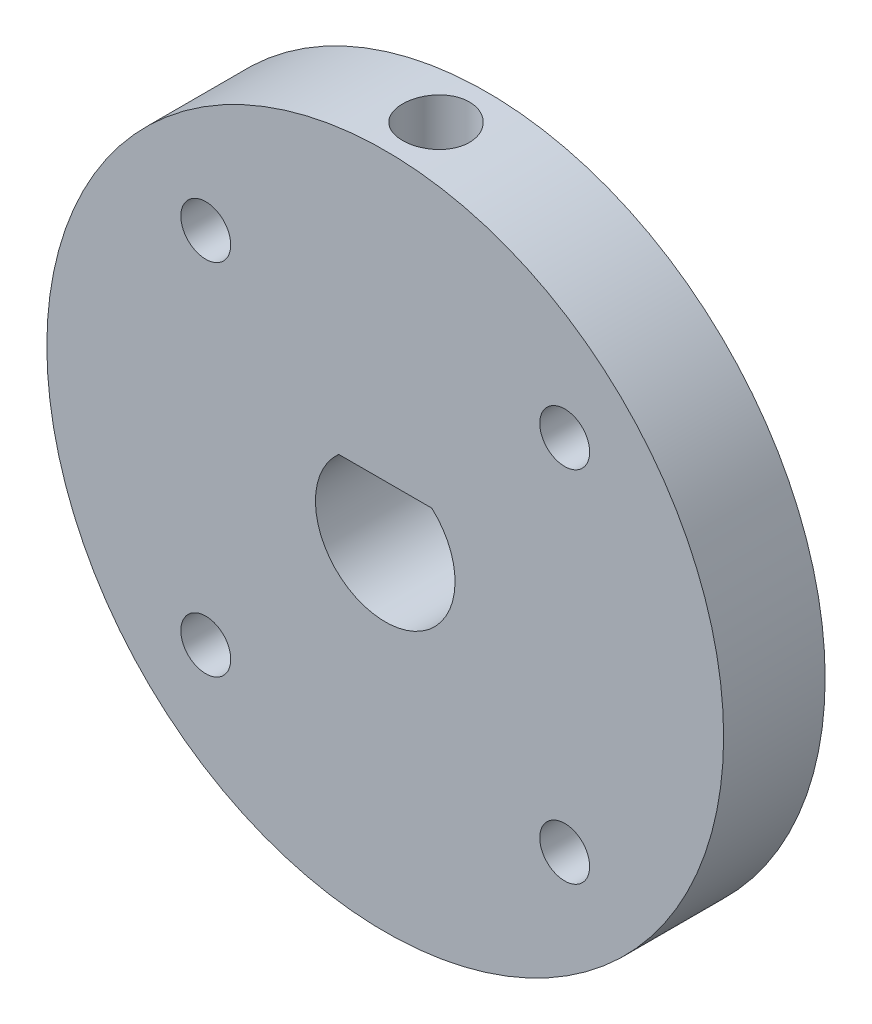
ISO-10303-21;
HEADER;
FILE_DESCRIPTION(('STEP AP214'),'2;1');
FILE_NAME('part.step','',(''),(''),'','','');
FILE_SCHEMA(('AUTOMOTIVE_DESIGN { 1 0 10303 214 1 1 1 1 }'));
ENDSEC;
DATA;
#1=APPLICATION_CONTEXT('core data for automotive mechanical design processes');
#2=APPLICATION_PROTOCOL_DEFINITION('international standard','automotive_design',2000,#1);
#3=PRODUCT_CONTEXT('',#1,'mechanical');
#4=PRODUCT('Part','Part','',(#3));
#5=PRODUCT_RELATED_PRODUCT_CATEGORY('part','',(#4));
#6=PRODUCT_DEFINITION_FORMATION('','',#4);
#7=PRODUCT_DEFINITION_CONTEXT('part definition',#1,'design');
#8=PRODUCT_DEFINITION('design','',#6,#7);
#9=PRODUCT_DEFINITION_SHAPE('','',#8);
#10=(LENGTH_UNIT() NAMED_UNIT(*) SI_UNIT(.MILLI.,.METRE.));
#11=(NAMED_UNIT(*) PLANE_ANGLE_UNIT() SI_UNIT($,.RADIAN.));
#12=(NAMED_UNIT(*) SI_UNIT($,.STERADIAN.) SOLID_ANGLE_UNIT());
#13=UNCERTAINTY_MEASURE_WITH_UNIT(LENGTH_MEASURE(1.E-05),#10,'distance_accuracy_value','');
#14=(GEOMETRIC_REPRESENTATION_CONTEXT(3) GLOBAL_UNCERTAINTY_ASSIGNED_CONTEXT((#13)) GLOBAL_UNIT_ASSIGNED_CONTEXT((#10,
#11,#12)) REPRESENTATION_CONTEXT('',''));
#15=CARTESIAN_POINT('',(0.,0.,0.));
#16=DIRECTION('',(0.,0.,1.));
#17=DIRECTION('',(1.,0.,0.));
#18=AXIS2_PLACEMENT_3D('',#15,#16,#17);
#19=CARTESIAN_POINT('',(0.,0.,6.));
#20=DIRECTION('',(0.,0.,-1.));
#21=DIRECTION('',(-1.,0.,0.));
#22=AXIS2_PLACEMENT_3D('',#19,#20,#21);
#23=CYLINDRICAL_SURFACE('',#22,20.);
#24=CARTESIAN_POINT('',(0.,0.,6.));
#25=DIRECTION('',(0.,0.,1.));
#26=DIRECTION('',(1.,0.,0.));
#27=AXIS2_PLACEMENT_3D('',#24,#25,#26);
#28=CIRCLE('',#27,20.);
#29=CARTESIAN_POINT('',(20.,0.,6.));
#30=VERTEX_POINT('',#29);
#31=EDGE_CURVE('E81',#30,#30,#28,.T.);
#32=ORIENTED_EDGE('',*,*,#31,.F.);
#33=EDGE_LOOP('',(#32));
#34=FACE_BOUND('',#33,.T.);
#35=CARTESIAN_POINT('',(0.,0.,0.));
#36=DIRECTION('',(0.,0.,1.));
#37=DIRECTION('',(1.,0.,0.));
#38=AXIS2_PLACEMENT_3D('',#35,#36,#37);
#39=CIRCLE('',#38,20.);
#40=CARTESIAN_POINT('',(20.,0.,0.));
#41=VERTEX_POINT('',#40);
#42=EDGE_CURVE('E86',#41,#41,#39,.T.);
#43=ORIENTED_EDGE('',*,*,#42,.T.);
#44=EDGE_LOOP('',(#43));
#45=FACE_BOUND('',#44,.T.);
#46=CARTESIAN_POINT('',(0.,20.,1.025));
#47=CARTESIAN_POINT('',(0.110647535145343,19.9999987407818,1.02500479503878));
#48=CARTESIAN_POINT('',(0.221368401062698,19.9990720248061,1.03432969100543));
#49=CARTESIAN_POINT('',(0.439741021909076,19.9954642821194,1.07138804214519));
#50=CARTESIAN_POINT('',(0.547389250699986,19.9927813182498,1.09914182504601));
#51=CARTESIAN_POINT('',(0.756422690611238,19.9859639650018,1.17224255627926));
#52=CARTESIAN_POINT('',(0.857811622581228,19.9818304478696,1.2175789335703));
#53=CARTESIAN_POINT('',(1.0515184831237,19.9725742973183,1.32453753065725));
#54=CARTESIAN_POINT('',(1.14383822149066,19.9674518618493,1.38615649210428));
#55=CARTESIAN_POINT('',(1.31713273369894,19.9567716385834,1.52416357748141));
#56=CARTESIAN_POINT('',(1.39807117732535,19.9512125411583,1.60059722390614));
#57=CARTESIAN_POINT('',(1.54599334487629,19.9402963812115,1.76596698056571));
#58=CARTESIAN_POINT('',(1.612976426048,19.9349393280047,1.85490366634679));
#59=CARTESIAN_POINT('',(1.73121468322507,19.9250203545544,2.04298171386992));
#60=CARTESIAN_POINT('',(1.78243705848171,19.9204601009932,2.14214379175961));
#61=CARTESIAN_POINT('',(1.86749043755245,19.9126671838254,2.34771407131116));
#62=CARTESIAN_POINT('',(1.90132186103417,19.9094344881835,2.4541220980481));
#63=CARTESIAN_POINT('',(1.9505254663674,19.9046744699559,2.6707937347085));
#64=CARTESIAN_POINT('',(1.96595781991926,19.9031415895079,2.78104355619567));
#65=CARTESIAN_POINT('',(1.97811121002124,19.9019374772504,3.0025783324023));
#66=CARTESIAN_POINT('',(1.97483272692396,19.902266197649,3.11386326047483));
#67=CARTESIAN_POINT('',(1.9497071142332,19.9047430729143,3.33389469277258));
#68=CARTESIAN_POINT('',(1.92792565937875,19.9068847925989,3.44264877908208));
#69=CARTESIAN_POINT('',(1.86651457432106,19.9127362921256,3.6549501061638));
#70=CARTESIAN_POINT('',(1.82688470840645,19.9164460926762,3.7584972781519));
#71=CARTESIAN_POINT('',(1.73082917109225,19.92502315631,3.9576530619104));
#72=CARTESIAN_POINT('',(1.67437433542529,19.9298924262377,4.05324751741782));
#73=CARTESIAN_POINT('',(1.54629236664339,19.9402380727217,4.23362939099426));
#74=CARTESIAN_POINT('',(1.47466480055542,19.945714466601,4.31841650055138));
#75=CARTESIAN_POINT('',(1.31790368002739,19.9566859783403,4.47515853931865));
#76=CARTESIAN_POINT('',(1.23271340259438,19.9621810755175,4.54705675227942));
#77=CARTESIAN_POINT('',(1.05144213929709,19.9725485901,4.67554056362076));
#78=CARTESIAN_POINT('',(0.955361141678099,19.9774210068334,4.73212614547369));
#79=CARTESIAN_POINT('',(0.754996727224631,19.9859957134195,4.82837606074223));
#80=CARTESIAN_POINT('',(0.650711933361329,19.9896978063048,4.86803754619529));
#81=CARTESIAN_POINT('',(0.436918586682544,19.9955127077584,4.92927200820207));
#82=CARTESIAN_POINT('',(0.327410186288337,19.9976255626694,4.95084551220993));
#83=CARTESIAN_POINT('',(0.106769369785256,20.0000179722653,4.97521973535448));
#84=CARTESIAN_POINT('',(-0.00435432035753699,20.0003051705273,4.97809872493383));
#85=CARTESIAN_POINT('',(-0.225502644068726,19.9990343962199,4.96520772725976));
#86=CARTESIAN_POINT('',(-0.335527292090928,19.9974764479488,4.94943798558743));
#87=CARTESIAN_POINT('',(-0.551128646554909,19.9926953604379,4.89976209935281));
#88=CARTESIAN_POINT('',(-0.656713870881308,19.9894755837212,4.86589257279338));
#89=CARTESIAN_POINT('',(-0.860703897794724,19.9817320952863,4.78101616137267));
#90=CARTESIAN_POINT('',(-0.959108543131687,19.9772083550229,4.7300089013431));
#91=CARTESIAN_POINT('',(-1.14629813778648,19.9673440005286,4.61211061161216));
#92=CARTESIAN_POINT('',(-1.23505053568203,19.9620007602099,4.54516812257772));
#93=CARTESIAN_POINT('',(-1.40008685368494,19.9511054950888,4.39737345558014));
#94=CARTESIAN_POINT('',(-1.47637046865418,19.945553465181,4.31652093730782));
#95=CARTESIAN_POINT('',(-1.61457530678421,19.9348434031054,4.14285995236262));
#96=CARTESIAN_POINT('',(-1.67644518471958,19.9296868220797,4.05001052146078));
#97=CARTESIAN_POINT('',(-1.78371339283766,19.9203734367438,3.85519356686427));
#98=CARTESIAN_POINT('',(-1.82911194341694,19.9162166190564,3.75322616519646));
#99=CARTESIAN_POINT('',(-1.90206271995818,19.9093823796095,3.54324430077718));
#100=CARTESIAN_POINT('',(-1.92964556785477,19.9067024205708,3.43524056253589));
#101=CARTESIAN_POINT('',(-1.96628134736717,19.9031173918067,3.21610686494976));
#102=CARTESIAN_POINT('',(-1.9753347960437,19.9022122725546,3.10497699292704));
#103=CARTESIAN_POINT('',(-1.97464770519457,19.9022804166709,2.88325592986));
#104=CARTESIAN_POINT('',(-1.96498782383449,19.9032456185889,2.77266447753319));
#105=CARTESIAN_POINT('',(-1.92731732280931,19.9069284662373,2.55468357278458));
#106=CARTESIAN_POINT('',(-1.89930668182911,19.9096461140034,2.44729412408218));
#107=CARTESIAN_POINT('',(-1.82575188996325,19.9165254147699,2.23876575674022));
#108=CARTESIAN_POINT('',(-1.78021003345898,19.9206868788052,2.13762602218448));
#109=CARTESIAN_POINT('',(-1.67289394768369,19.9299852976413,1.94441336940532));
#110=CARTESIAN_POINT('',(-1.6111198225314,19.9351222461851,1.85234039303014));
#111=CARTESIAN_POINT('',(-1.47278978183527,19.945819336512,1.67946152657092));
#112=CARTESIAN_POINT('',(-1.39617378490567,19.9513811407643,1.59870381274083));
#113=CARTESIAN_POINT('',(-1.23045312376364,19.9622860808253,1.45115532917505));
#114=CARTESIAN_POINT('',(-1.14134547013147,19.9676291638945,1.38436791228009));
#115=CARTESIAN_POINT('',(-0.952931695277806,19.9775082520228,1.26652724431091));
#116=CARTESIAN_POINT('',(-0.85360098893347,19.9820422362502,1.21551316293035));
#117=CARTESIAN_POINT('',(-0.647802458769994,19.9897701793613,1.13095597871753));
#118=CARTESIAN_POINT('',(-0.541342849119899,19.9929656507286,1.0973931460333));
#119=CARTESIAN_POINT('',(-0.361898744198261,19.9968521913084,1.05707465949665));
#120=CARTESIAN_POINT('',(-0.290061915676167,19.9980271256835,1.04506306009656));
#121=CARTESIAN_POINT('',(-0.145493959679137,19.999601442516,1.02902416967484));
#122=CARTESIAN_POINT('',(-0.0727628357800491,20.0000008280735,1.02499684673844));
#123=CARTESIAN_POINT('',(0.,20.,1.025));
#124=B_SPLINE_CURVE_WITH_KNOTS('',3,(#46,#47,#48,#49,#50,#51,#52,#53,#54,#55,#56,#57,#58,#59,
#60,#61,#62,#63,#64,#65,#66,#67,#68,#69,#70,#71,#72,#73,#74,#75,#76,#77,#78,#79,#80,#81,#82,#83,
#84,#85,#86,#87,#88,#89,#90,#91,#92,#93,#94,#95,#96,#97,#98,#99,#100,#101,#102,#103,#104,#105,
#106,#107,#108,#109,#110,#111,#112,#113,#114,#115,#116,#117,#118,#119,#120,#121,#122,#123),
.UNSPECIFIED.,.T.,.F.,(4,2,2,2,2,2,2,2,2,2,2,2,2,2,2,2,2,2,2,2,2,2,2,2,2,2,2,2,2,2,2,2,2,2,2,2,
2,2,4),(0.,0.331676905885973,0.663720272467431,0.995564315999958,1.32734200360903,
1.66015581858716,1.99298495883902,2.32650216057393,2.66001131370136,2.99242675138593,
3.32483365519768,3.65606561494179,3.98730194916124,4.3191158187277,4.65093915829827,
4.98418860809037,5.31743841757289,5.65074428375893,5.98404043024941,6.31594022327231,
6.64783564562751,6.97906213235137,7.3102958705463,7.64261412384982,7.9749405084836,
8.30843321168898,8.64192145239076,8.97483495159038,9.30773916075119,9.63921167878131,
9.97068458183019,10.3021141184143,10.6335415291599,10.9663397385287,11.299217727332,
11.6329158285043,11.966235835894,12.1843504886186,12.4024642694933),.UNSPECIFIED.);
#125=CARTESIAN_POINT('',(0.,20.,1.025));
#126=VERTEX_POINT('',#125);
#127=EDGE_CURVE('E179',#126,#126,#124,.T.);
#128=ORIENTED_EDGE('',*,*,#127,.T.);
#129=EDGE_LOOP('',(#128));
#130=FACE_BOUND('',#129,.T.);
#131=ADVANCED_FACE('F47',(#34,#45,#130),#23,.T.);
#132=CARTESIAN_POINT('',(0.,0.,6.));
#133=DIRECTION('',(0.,0.,-1.));
#134=DIRECTION('',(-1.,0.,0.));
#135=AXIS2_PLACEMENT_3D('',#132,#133,#134);
#136=CYLINDRICAL_SURFACE('',#135,4.125);
#137=CARTESIAN_POINT('',(0.,0.,0.));
#138=DIRECTION('',(0.,0.,1.));
#139=DIRECTION('',(1.,0.,0.));
#140=AXIS2_PLACEMENT_3D('',#137,#138,#139);
#141=CIRCLE('',#140,4.125);
#142=CARTESIAN_POINT('',(-2.7495454169735,3.075,0.));
#143=VERTEX_POINT('',#142);
#144=CARTESIAN_POINT('',(2.7495454169735,3.075,0.));
#145=VERTEX_POINT('',#144);
#146=EDGE_CURVE('E78',#143,#145,#141,.T.);
#147=ORIENTED_EDGE('',*,*,#146,.F.);
#148=DIRECTION('',(0.,0.,-1.));
#149=VECTOR('',#148,1.);
#150=CARTESIAN_POINT('',(-2.7495454169735,3.075,6.));
#151=LINE('',#150,#149);
#152=CARTESIAN_POINT('',(-2.7495454169735,3.075,6.));
#153=VERTEX_POINT('',#152);
#154=EDGE_CURVE('E11',#153,#143,#151,.T.);
#155=ORIENTED_EDGE('',*,*,#154,.F.);
#156=CARTESIAN_POINT('',(0.,0.,6.));
#157=DIRECTION('',(0.,0.,1.));
#158=DIRECTION('',(1.,0.,0.));
#159=AXIS2_PLACEMENT_3D('',#156,#157,#158);
#160=CIRCLE('',#159,4.125);
#161=CARTESIAN_POINT('',(2.7495454169735,3.075,6.));
#162=VERTEX_POINT('',#161);
#163=EDGE_CURVE('E79',#153,#162,#160,.T.);
#164=ORIENTED_EDGE('',*,*,#163,.T.);
#165=DIRECTION('',(0.,0.,-1.));
#166=VECTOR('',#165,1.);
#167=CARTESIAN_POINT('',(2.7495454169735,3.075,6.));
#168=LINE('',#167,#166);
#169=EDGE_CURVE('E57',#162,#145,#168,.T.);
#170=ORIENTED_EDGE('',*,*,#169,.T.);
#171=EDGE_LOOP('',(#147,#155,#164,#170));
#172=FACE_BOUND('',#171,.T.);
#173=ADVANCED_FACE('F76',(#172),#136,.F.);
#174=CARTESIAN_POINT('',(0.,3.075,6.));
#175=DIRECTION('',(0.,1.,0.));
#176=DIRECTION('',(0.,0.,1.));
#177=AXIS2_PLACEMENT_3D('',#174,#175,#176);
#178=PLANE('',#177);
#179=CARTESIAN_POINT('',(0.,3.075,3.));
#180=DIRECTION('',(0.,1.,0.));
#181=DIRECTION('',(0.,0.,1.));
#182=AXIS2_PLACEMENT_3D('',#179,#180,#181);
#183=CIRCLE('',#182,1.975);
#184=CARTESIAN_POINT('',(0.,3.075,4.975));
#185=VERTEX_POINT('',#184);
#186=EDGE_CURVE('E115',#185,#185,#183,.T.);
#187=ORIENTED_EDGE('',*,*,#186,.T.);
#188=EDGE_LOOP('',(#187));
#189=FACE_BOUND('',#188,.T.);
#190=DIRECTION('',(1.,0.,0.));
#191=VECTOR('',#190,1.);
#192=CARTESIAN_POINT('',(0.,3.075,0.));
#193=LINE('',#192,#191);
#194=EDGE_CURVE('E82',#143,#145,#193,.T.);
#195=ORIENTED_EDGE('',*,*,#194,.T.);
#196=ORIENTED_EDGE('',*,*,#169,.F.);
#197=DIRECTION('',(1.,0.,0.));
#198=VECTOR('',#197,1.);
#199=CARTESIAN_POINT('',(0.,3.075,6.));
#200=LINE('',#199,#198);
#201=EDGE_CURVE('E64',#153,#162,#200,.T.);
#202=ORIENTED_EDGE('',*,*,#201,.F.);
#203=ORIENTED_EDGE('',*,*,#154,.T.);
#204=EDGE_LOOP('',(#195,#196,#202,#203));
#205=FACE_BOUND('',#204,.T.);
#206=ADVANCED_FACE('F83',(#189,#205),#178,.F.);
#207=CARTESIAN_POINT('',(10.6066017177982,10.6066017177982,6.));
#208=DIRECTION('',(0.,0.,-1.));
#209=DIRECTION('',(-1.,0.,0.));
#210=AXIS2_PLACEMENT_3D('',#207,#208,#209);
#211=CYLINDRICAL_SURFACE('',#210,1.475);
#212=CARTESIAN_POINT('',(10.6066017177982,10.6066017177982,6.));
#213=DIRECTION('',(0.,0.,1.));
#214=DIRECTION('',(1.,0.,0.));
#215=AXIS2_PLACEMENT_3D('',#212,#213,#214);
#216=CIRCLE('',#215,1.475);
#217=CARTESIAN_POINT('',(12.0816017177982,10.6066017177982,6.));
#218=VERTEX_POINT('',#217);
#219=EDGE_CURVE('E121',#218,#218,#216,.T.);
#220=ORIENTED_EDGE('',*,*,#219,.T.);
#221=EDGE_LOOP('',(#220));
#222=FACE_BOUND('',#221,.T.);
#223=CARTESIAN_POINT('',(10.6066017177982,10.6066017177982,0.));
#224=DIRECTION('',(0.,0.,1.));
#225=DIRECTION('',(1.,0.,0.));
#226=AXIS2_PLACEMENT_3D('',#223,#224,#225);
#227=CIRCLE('',#226,1.475);
#228=CARTESIAN_POINT('',(12.0816017177982,10.6066017177982,0.));
#229=VERTEX_POINT('',#228);
#230=EDGE_CURVE('E91',#229,#229,#227,.T.);
#231=ORIENTED_EDGE('',*,*,#230,.F.);
#232=EDGE_LOOP('',(#231));
#233=FACE_BOUND('',#232,.T.);
#234=ADVANCED_FACE('F148',(#222,#233),#211,.F.);
#235=CARTESIAN_POINT('',(10.6066017177982,-10.6066017177982,6.));
#236=DIRECTION('',(0.,0.,-1.));
#237=DIRECTION('',(-1.,0.,0.));
#238=AXIS2_PLACEMENT_3D('',#235,#236,#237);
#239=CYLINDRICAL_SURFACE('',#238,1.475);
#240=CARTESIAN_POINT('',(10.6066017177982,-10.6066017177982,6.));
#241=DIRECTION('',(0.,0.,1.));
#242=DIRECTION('',(1.,0.,0.));
#243=AXIS2_PLACEMENT_3D('',#240,#241,#242);
#244=CIRCLE('',#243,1.475);
#245=CARTESIAN_POINT('',(12.0816017177982,-10.6066017177982,6.));
#246=VERTEX_POINT('',#245);
#247=EDGE_CURVE('E112',#246,#246,#244,.T.);
#248=ORIENTED_EDGE('',*,*,#247,.T.);
#249=EDGE_LOOP('',(#248));
#250=FACE_BOUND('',#249,.T.);
#251=CARTESIAN_POINT('',(10.6066017177982,-10.6066017177982,0.));
#252=DIRECTION('',(0.,0.,1.));
#253=DIRECTION('',(1.,0.,0.));
#254=AXIS2_PLACEMENT_3D('',#251,#252,#253);
#255=CIRCLE('',#254,1.475);
#256=CARTESIAN_POINT('',(12.0816017177982,-10.6066017177982,0.));
#257=VERTEX_POINT('',#256);
#258=EDGE_CURVE('E95',#257,#257,#255,.T.);
#259=ORIENTED_EDGE('',*,*,#258,.F.);
#260=EDGE_LOOP('',(#259));
#261=FACE_BOUND('',#260,.T.);
#262=ADVANCED_FACE('F145',(#250,#261),#239,.F.);
#263=CARTESIAN_POINT('',(-10.6066017177983,-10.6066017177982,6.));
#264=DIRECTION('',(0.,0.,-1.));
#265=DIRECTION('',(-1.,0.,0.));
#266=AXIS2_PLACEMENT_3D('',#263,#264,#265);
#267=CYLINDRICAL_SURFACE('',#266,1.475);
#268=CARTESIAN_POINT('',(-10.6066017177983,-10.6066017177982,6.));
#269=DIRECTION('',(0.,0.,1.));
#270=DIRECTION('',(1.,0.,0.));
#271=AXIS2_PLACEMENT_3D('',#268,#269,#270);
#272=CIRCLE('',#271,1.475);
#273=CARTESIAN_POINT('',(-9.13160171779827,-10.6066017177982,6.));
#274=VERTEX_POINT('',#273);
#275=EDGE_CURVE('E106',#274,#274,#272,.T.);
#276=ORIENTED_EDGE('',*,*,#275,.T.);
#277=EDGE_LOOP('',(#276));
#278=FACE_BOUND('',#277,.T.);
#279=CARTESIAN_POINT('',(-10.6066017177983,-10.6066017177982,0.));
#280=DIRECTION('',(0.,0.,1.));
#281=DIRECTION('',(1.,0.,0.));
#282=AXIS2_PLACEMENT_3D('',#279,#280,#281);
#283=CIRCLE('',#282,1.475);
#284=CARTESIAN_POINT('',(-9.13160171779827,-10.6066017177982,0.));
#285=VERTEX_POINT('',#284);
#286=EDGE_CURVE('E136',#285,#285,#283,.T.);
#287=ORIENTED_EDGE('',*,*,#286,.F.);
#288=EDGE_LOOP('',(#287));
#289=FACE_BOUND('',#288,.T.);
#290=ADVANCED_FACE('F147',(#278,#289),#267,.F.);
#291=CARTESIAN_POINT('',(-10.6066017177983,10.6066017177982,6.));
#292=DIRECTION('',(0.,0.,-1.));
#293=DIRECTION('',(-1.,0.,0.));
#294=AXIS2_PLACEMENT_3D('',#291,#292,#293);
#295=CYLINDRICAL_SURFACE('',#294,1.475);
#296=CARTESIAN_POINT('',(-10.6066017177983,10.6066017177982,6.));
#297=DIRECTION('',(0.,0.,1.));
#298=DIRECTION('',(1.,0.,0.));
#299=AXIS2_PLACEMENT_3D('',#296,#297,#298);
#300=CIRCLE('',#299,1.475);
#301=CARTESIAN_POINT('',(-9.13160171779827,10.6066017177982,6.));
#302=VERTEX_POINT('',#301);
#303=EDGE_CURVE('E101',#302,#302,#300,.T.);
#304=ORIENTED_EDGE('',*,*,#303,.T.);
#305=EDGE_LOOP('',(#304));
#306=FACE_BOUND('',#305,.T.);
#307=CARTESIAN_POINT('',(-10.6066017177983,10.6066017177982,0.));
#308=DIRECTION('',(0.,0.,1.));
#309=DIRECTION('',(1.,0.,0.));
#310=AXIS2_PLACEMENT_3D('',#307,#308,#309);
#311=CIRCLE('',#310,1.475);
#312=CARTESIAN_POINT('',(-9.13160171779827,10.6066017177982,0.));
#313=VERTEX_POINT('',#312);
#314=EDGE_CURVE('E132',#313,#313,#311,.T.);
#315=ORIENTED_EDGE('',*,*,#314,.F.);
#316=EDGE_LOOP('',(#315));
#317=FACE_BOUND('',#316,.T.);
#318=ADVANCED_FACE('F49',(#306,#317),#295,.F.);
#319=CARTESIAN_POINT('',(0.,0.,6.));
#320=DIRECTION('',(0.,0.,1.));
#321=DIRECTION('',(1.,0.,0.));
#322=AXIS2_PLACEMENT_3D('',#319,#320,#321);
#323=PLANE('',#322);
#324=ORIENTED_EDGE('',*,*,#303,.F.);
#325=EDGE_LOOP('',(#324));
#326=FACE_BOUND('',#325,.T.);
#327=ORIENTED_EDGE('',*,*,#275,.F.);
#328=EDGE_LOOP('',(#327));
#329=FACE_BOUND('',#328,.T.);
#330=ORIENTED_EDGE('',*,*,#247,.F.);
#331=EDGE_LOOP('',(#330));
#332=FACE_BOUND('',#331,.T.);
#333=ORIENTED_EDGE('',*,*,#219,.F.);
#334=EDGE_LOOP('',(#333));
#335=FACE_BOUND('',#334,.T.);
#336=ORIENTED_EDGE('',*,*,#163,.F.);
#337=ORIENTED_EDGE('',*,*,#201,.T.);
#338=EDGE_LOOP('',(#336,#337));
#339=FACE_BOUND('',#338,.T.);
#340=ORIENTED_EDGE('',*,*,#31,.T.);
#341=EDGE_LOOP('',(#340));
#342=FACE_BOUND('',#341,.T.);
#343=ADVANCED_FACE('F193',(#326,#329,#332,#335,#339,#342),#323,.T.);
#344=CARTESIAN_POINT('',(0.,0.,0.));
#345=DIRECTION('',(0.,0.,1.));
#346=DIRECTION('',(1.,0.,0.));
#347=AXIS2_PLACEMENT_3D('',#344,#345,#346);
#348=PLANE('',#347);
#349=ORIENTED_EDGE('',*,*,#314,.T.);
#350=EDGE_LOOP('',(#349));
#351=FACE_BOUND('',#350,.T.);
#352=ORIENTED_EDGE('',*,*,#286,.T.);
#353=EDGE_LOOP('',(#352));
#354=FACE_BOUND('',#353,.T.);
#355=ORIENTED_EDGE('',*,*,#258,.T.);
#356=EDGE_LOOP('',(#355));
#357=FACE_BOUND('',#356,.T.);
#358=ORIENTED_EDGE('',*,*,#230,.T.);
#359=EDGE_LOOP('',(#358));
#360=FACE_BOUND('',#359,.T.);
#361=ORIENTED_EDGE('',*,*,#146,.T.);
#362=ORIENTED_EDGE('',*,*,#194,.F.);
#363=EDGE_LOOP('',(#361,#362));
#364=FACE_BOUND('',#363,.T.);
#365=ORIENTED_EDGE('',*,*,#42,.F.);
#366=EDGE_LOOP('',(#365));
#367=FACE_BOUND('',#366,.T.);
#368=ADVANCED_FACE('F88',(#351,#354,#357,#360,#364,#367),#348,.F.);
#369=CARTESIAN_POINT('',(0.,20.001,3.));
#370=DIRECTION('',(0.,-1.,0.));
#371=DIRECTION('',(0.,0.,-1.));
#372=AXIS2_PLACEMENT_3D('',#369,#370,#371);
#373=CYLINDRICAL_SURFACE('',#372,1.975);
#374=ORIENTED_EDGE('',*,*,#127,.F.);
#375=EDGE_LOOP('',(#374));
#376=FACE_BOUND('',#375,.T.);
#377=ORIENTED_EDGE('',*,*,#186,.F.);
#378=EDGE_LOOP('',(#377));
#379=FACE_BOUND('',#378,.T.);
#380=ADVANCED_FACE('F189',(#376,#379),#373,.F.);
#381=CLOSED_SHELL('',(#131,#173,#206,#234,#262,#290,#318,#343,#368,#380));
#382=MANIFOLD_SOLID_BREP('B2',#381);
#383=ADVANCED_BREP_SHAPE_REPRESENTATION('',(#18,#382),#14);
#384=SHAPE_DEFINITION_REPRESENTATION(#9,#383);
ENDSEC;
END-ISO-10303-21;
